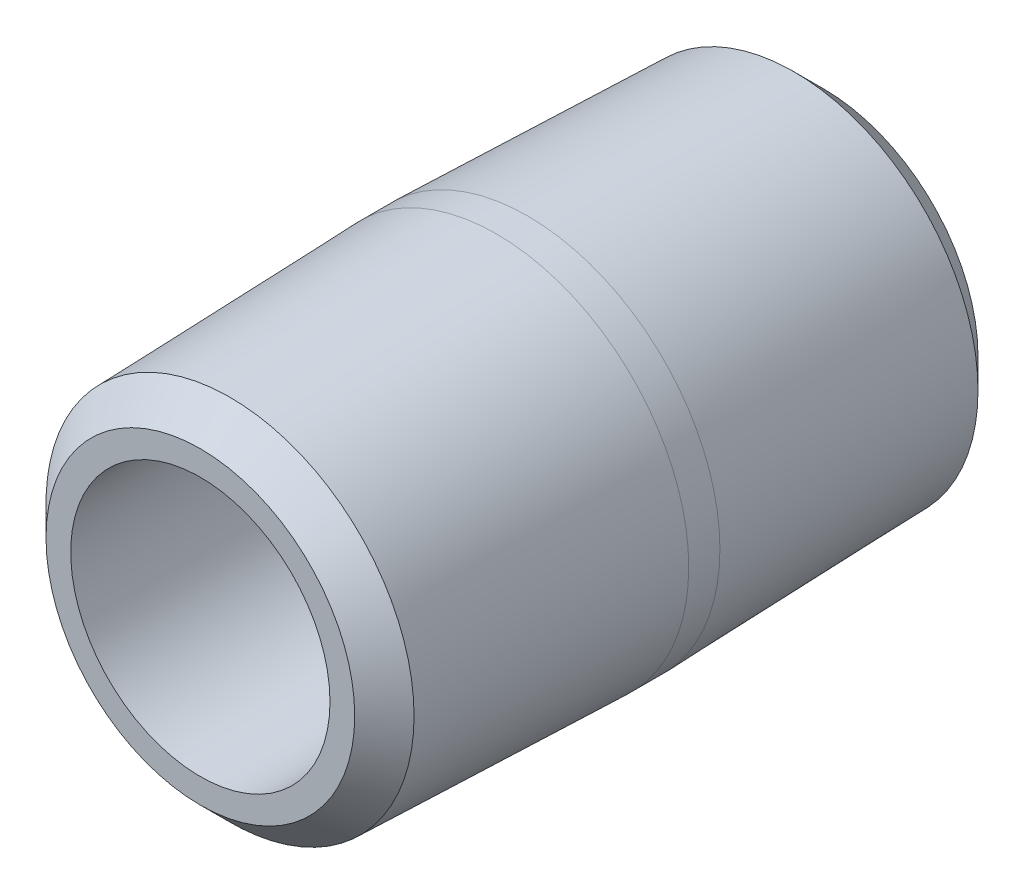
ISO-10303-21;
HEADER;
FILE_DESCRIPTION(('STEP AP214'),'2;1');
FILE_NAME('part.step','',(''),(''),'','','');
FILE_SCHEMA(('AUTOMOTIVE_DESIGN { 1 0 10303 214 1 1 1 1 }'));
ENDSEC;
DATA;
#1=APPLICATION_CONTEXT('core data for automotive mechanical design processes');
#2=APPLICATION_PROTOCOL_DEFINITION('international standard','automotive_design',2000,#1);
#3=PRODUCT_CONTEXT('',#1,'mechanical');
#4=PRODUCT('Part','Part','',(#3));
#5=PRODUCT_RELATED_PRODUCT_CATEGORY('part','',(#4));
#6=PRODUCT_DEFINITION_FORMATION('','',#4);
#7=PRODUCT_DEFINITION_CONTEXT('part definition',#1,'design');
#8=PRODUCT_DEFINITION('design','',#6,#7);
#9=PRODUCT_DEFINITION_SHAPE('','',#8);
#10=(LENGTH_UNIT() NAMED_UNIT(*) SI_UNIT(.MILLI.,.METRE.));
#11=(NAMED_UNIT(*) PLANE_ANGLE_UNIT() SI_UNIT($,.RADIAN.));
#12=(NAMED_UNIT(*) SI_UNIT($,.STERADIAN.) SOLID_ANGLE_UNIT());
#13=UNCERTAINTY_MEASURE_WITH_UNIT(LENGTH_MEASURE(1.E-05),#10,'distance_accuracy_value','');
#14=(GEOMETRIC_REPRESENTATION_CONTEXT(3) GLOBAL_UNCERTAINTY_ASSIGNED_CONTEXT((#13)) GLOBAL_UNIT_ASSIGNED_CONTEXT((#10,
#11,#12)) REPRESENTATION_CONTEXT('',''));
#15=CARTESIAN_POINT('',(0.,0.,0.));
#16=DIRECTION('',(0.,0.,1.));
#17=DIRECTION('',(1.,0.,0.));
#18=AXIS2_PLACEMENT_3D('',#15,#16,#17);
#19=CARTESIAN_POINT('',(0.,0.,11.1125));
#20=DIRECTION('',(0.,0.,1.));
#21=DIRECTION('',(1.,0.,0.));
#22=AXIS2_PLACEMENT_3D('',#19,#20,#21);
#23=CYLINDRICAL_SURFACE('',#22,4.6228);
#24=CARTESIAN_POINT('',(0.,0.,-11.1125));
#25=DIRECTION('',(0.,0.,1.));
#26=DIRECTION('',(1.,0.,0.));
#27=AXIS2_PLACEMENT_3D('',#24,#25,#26);
#28=CIRCLE('',#27,4.6228);
#29=CARTESIAN_POINT('',(4.6228,0.,-11.1125));
#30=VERTEX_POINT('',#29);
#31=EDGE_CURVE('E10',#30,#30,#28,.T.);
#32=ORIENTED_EDGE('',*,*,#31,.F.);
#33=EDGE_LOOP('',(#32));
#34=FACE_BOUND('',#33,.T.);
#35=CARTESIAN_POINT('',(0.,0.,11.1125));
#36=DIRECTION('',(0.,0.,1.));
#37=DIRECTION('',(1.,0.,0.));
#38=AXIS2_PLACEMENT_3D('',#35,#36,#37);
#39=CIRCLE('',#38,4.6228);
#40=CARTESIAN_POINT('',(4.6228,0.,11.1125));
#41=VERTEX_POINT('',#40);
#42=EDGE_CURVE('E74',#41,#41,#39,.T.);
#43=ORIENTED_EDGE('',*,*,#42,.T.);
#44=EDGE_LOOP('',(#43));
#45=FACE_BOUND('',#44,.T.);
#46=ADVANCED_FACE('F39',(#34,#45),#23,.F.);
#47=CARTESIAN_POINT('',(0.,4.6228,-11.1125));
#48=DIRECTION('',(0.,0.,1.));
#49=DIRECTION('',(1.,0.,0.));
#50=AXIS2_PLACEMENT_3D('',#47,#48,#49);
#51=PLANE('',#50);
#52=CARTESIAN_POINT('',(0.,0.,-11.1125));
#53=DIRECTION('',(0.,0.,1.));
#54=DIRECTION('',(1.,0.,0.));
#55=AXIS2_PLACEMENT_3D('',#52,#53,#54);
#56=CIRCLE('',#55,5.50392868657226);
#57=CARTESIAN_POINT('',(5.50392868657226,0.,-11.1125));
#58=VERTEX_POINT('',#57);
#59=EDGE_CURVE('E46',#58,#58,#56,.T.);
#60=ORIENTED_EDGE('',*,*,#59,.F.);
#61=EDGE_LOOP('',(#60));
#62=FACE_BOUND('',#61,.T.);
#63=ORIENTED_EDGE('',*,*,#31,.T.);
#64=EDGE_LOOP('',(#63));
#65=FACE_BOUND('',#64,.T.);
#66=ADVANCED_FACE('F112',(#62,#65),#51,.F.);
#67=CARTESIAN_POINT('',(0.,0.,-11.1125));
#68=DIRECTION('',(0.,0.,1.));
#69=DIRECTION('',(1.,0.,0.));
#70=AXIS2_PLACEMENT_3D('',#67,#68,#69);
#71=CONICAL_SURFACE('',#70,5.50392868657226,0.785398163397449);
#72=CARTESIAN_POINT('',(0.,0.,-10.0541666666667));
#73=DIRECTION('',(0.,0.,1.));
#74=DIRECTION('',(1.,0.,0.));
#75=AXIS2_PLACEMENT_3D('',#72,#73,#74);
#76=CIRCLE('',#75,6.56226201990559);
#77=CARTESIAN_POINT('',(6.56226201990559,0.,-10.0541666666667));
#78=VERTEX_POINT('',#77);
#79=EDGE_CURVE('E51',#78,#78,#76,.T.);
#80=ORIENTED_EDGE('',*,*,#79,.F.);
#81=EDGE_LOOP('',(#80));
#82=FACE_BOUND('',#81,.T.);
#83=ORIENTED_EDGE('',*,*,#59,.T.);
#84=EDGE_LOOP('',(#83));
#85=FACE_BOUND('',#84,.T.);
#86=ADVANCED_FACE('F107',(#82,#85),#71,.T.);
#87=CARTESIAN_POINT('',(0.,0.,-10.0541666666667));
#88=DIRECTION('',(0.,0.,1.));
#89=DIRECTION('',(1.,0.,0.));
#90=AXIS2_PLACEMENT_3D('',#87,#88,#89);
#91=CONICAL_SURFACE('',#90,6.56226201990559,0.0311250383272256);
#92=CARTESIAN_POINT('',(0.,0.,-0.555624999999999));
#93=DIRECTION('',(0.,0.,1.));
#94=DIRECTION('',(1.,0.,0.));
#95=AXIS2_PLACEMENT_3D('',#92,#93,#94);
#96=CIRCLE('',#95,6.858);
#97=CARTESIAN_POINT('',(6.858,0.,-0.555624999999999));
#98=VERTEX_POINT('',#97);
#99=EDGE_CURVE('E56',#98,#98,#96,.T.);
#100=ORIENTED_EDGE('',*,*,#99,.F.);
#101=EDGE_LOOP('',(#100));
#102=FACE_BOUND('',#101,.T.);
#103=ORIENTED_EDGE('',*,*,#79,.T.);
#104=EDGE_LOOP('',(#103));
#105=FACE_BOUND('',#104,.T.);
#106=ADVANCED_FACE('F101',(#102,#105),#91,.T.);
#107=CARTESIAN_POINT('',(0.,0.,11.1125));
#108=DIRECTION('',(0.,0.,1.));
#109=DIRECTION('',(1.,0.,0.));
#110=AXIS2_PLACEMENT_3D('',#107,#108,#109);
#111=CYLINDRICAL_SURFACE('',#110,6.858);
#112=CARTESIAN_POINT('',(0.,0.,0.555624999999999));
#113=DIRECTION('',(0.,0.,1.));
#114=DIRECTION('',(1.,0.,0.));
#115=AXIS2_PLACEMENT_3D('',#112,#113,#114);
#116=CIRCLE('',#115,6.858);
#117=CARTESIAN_POINT('',(6.858,0.,0.555624999999999));
#118=VERTEX_POINT('',#117);
#119=EDGE_CURVE('E62',#118,#118,#116,.T.);
#120=ORIENTED_EDGE('',*,*,#119,.F.);
#121=EDGE_LOOP('',(#120));
#122=FACE_BOUND('',#121,.T.);
#123=ORIENTED_EDGE('',*,*,#99,.T.);
#124=EDGE_LOOP('',(#123));
#125=FACE_BOUND('',#124,.T.);
#126=ADVANCED_FACE('F95',(#122,#125),#111,.T.);
#127=CARTESIAN_POINT('',(0.,0.,0.555624999999999));
#128=DIRECTION('',(0.,0.,-1.));
#129=DIRECTION('',(-1.,0.,0.));
#130=AXIS2_PLACEMENT_3D('',#127,#128,#129);
#131=CONICAL_SURFACE('',#130,6.858,0.0311250383272256);
#132=CARTESIAN_POINT('',(0.,0.,10.0541666666667));
#133=DIRECTION('',(0.,0.,1.));
#134=DIRECTION('',(1.,0.,0.));
#135=AXIS2_PLACEMENT_3D('',#132,#133,#134);
#136=CIRCLE('',#135,6.56226201990559);
#137=CARTESIAN_POINT('',(6.56226201990559,0.,10.0541666666667));
#138=VERTEX_POINT('',#137);
#139=EDGE_CURVE('E66',#138,#138,#136,.T.);
#140=ORIENTED_EDGE('',*,*,#139,.F.);
#141=EDGE_LOOP('',(#140));
#142=FACE_BOUND('',#141,.T.);
#143=ORIENTED_EDGE('',*,*,#119,.T.);
#144=EDGE_LOOP('',(#143));
#145=FACE_BOUND('',#144,.T.);
#146=ADVANCED_FACE('F89',(#142,#145),#131,.T.);
#147=CARTESIAN_POINT('',(0.,0.,10.0541666666667));
#148=DIRECTION('',(0.,0.,-1.));
#149=DIRECTION('',(-1.,0.,0.));
#150=AXIS2_PLACEMENT_3D('',#147,#148,#149);
#151=CONICAL_SURFACE('',#150,6.56226201990559,0.785398163397448);
#152=CARTESIAN_POINT('',(0.,0.,11.1125));
#153=DIRECTION('',(0.,0.,1.));
#154=DIRECTION('',(1.,0.,0.));
#155=AXIS2_PLACEMENT_3D('',#152,#153,#154);
#156=CIRCLE('',#155,5.50392868657226);
#157=CARTESIAN_POINT('',(5.50392868657226,0.,11.1125));
#158=VERTEX_POINT('',#157);
#159=EDGE_CURVE('E70',#158,#158,#156,.T.);
#160=ORIENTED_EDGE('',*,*,#159,.F.);
#161=EDGE_LOOP('',(#160));
#162=FACE_BOUND('',#161,.T.);
#163=ORIENTED_EDGE('',*,*,#139,.T.);
#164=EDGE_LOOP('',(#163));
#165=FACE_BOUND('',#164,.T.);
#166=ADVANCED_FACE('F83',(#162,#165),#151,.T.);
#167=CARTESIAN_POINT('',(0.,4.6228,11.1125));
#168=DIRECTION('',(0.,0.,-1.));
#169=DIRECTION('',(-1.,0.,0.));
#170=AXIS2_PLACEMENT_3D('',#167,#168,#169);
#171=PLANE('',#170);
#172=ORIENTED_EDGE('',*,*,#42,.F.);
#173=EDGE_LOOP('',(#172));
#174=FACE_BOUND('',#173,.T.);
#175=ORIENTED_EDGE('',*,*,#159,.T.);
#176=EDGE_LOOP('',(#175));
#177=FACE_BOUND('',#176,.T.);
#178=ADVANCED_FACE('F80',(#174,#177),#171,.F.);
#179=CLOSED_SHELL('',(#46,#66,#86,#106,#126,#146,#166,#178));
#180=MANIFOLD_SOLID_BREP('B2',#179);
#181=ADVANCED_BREP_SHAPE_REPRESENTATION('',(#18,#180),#14);
#182=SHAPE_DEFINITION_REPRESENTATION(#9,#181);
ENDSEC;
END-ISO-10303-21;
